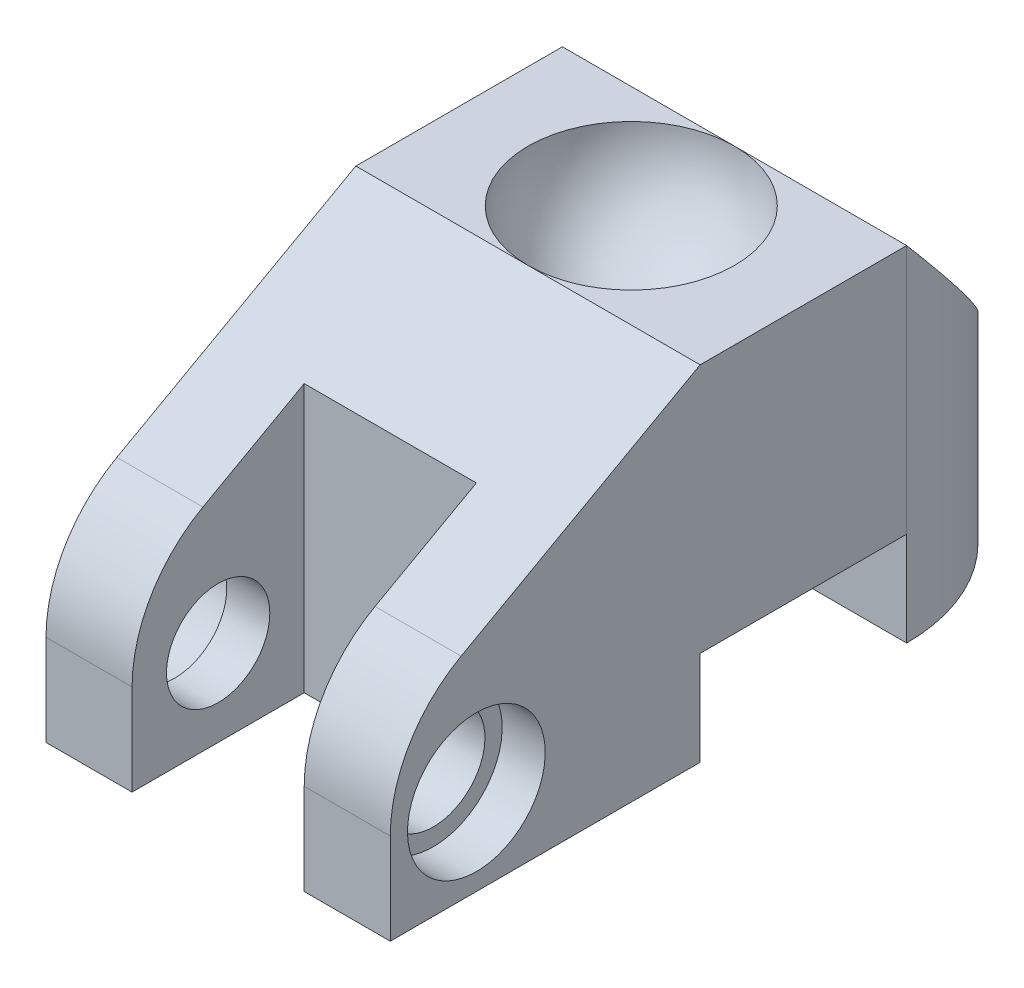
ISO-10303-21;
HEADER;
FILE_DESCRIPTION(('STEP AP214'),'2;1');
FILE_NAME('part.step','',(''),(''),'','','');
FILE_SCHEMA(('AUTOMOTIVE_DESIGN { 1 0 10303 214 1 1 1 1 }'));
ENDSEC;
DATA;
#1=APPLICATION_CONTEXT('core data for automotive mechanical design processes');
#2=APPLICATION_PROTOCOL_DEFINITION('international standard','automotive_design',2000,#1);
#3=PRODUCT_CONTEXT('',#1,'mechanical');
#4=PRODUCT('Part','Part','',(#3));
#5=PRODUCT_RELATED_PRODUCT_CATEGORY('part','',(#4));
#6=PRODUCT_DEFINITION_FORMATION('','',#4);
#7=PRODUCT_DEFINITION_CONTEXT('part definition',#1,'design');
#8=PRODUCT_DEFINITION('design','',#6,#7);
#9=PRODUCT_DEFINITION_SHAPE('','',#8);
#10=(LENGTH_UNIT() NAMED_UNIT(*) SI_UNIT(.MILLI.,.METRE.));
#11=(NAMED_UNIT(*) PLANE_ANGLE_UNIT() SI_UNIT($,.RADIAN.));
#12=(NAMED_UNIT(*) SI_UNIT($,.STERADIAN.) SOLID_ANGLE_UNIT());
#13=UNCERTAINTY_MEASURE_WITH_UNIT(LENGTH_MEASURE(1.E-05),#10,'distance_accuracy_value','');
#14=(GEOMETRIC_REPRESENTATION_CONTEXT(3) GLOBAL_UNCERTAINTY_ASSIGNED_CONTEXT((#13)) GLOBAL_UNIT_ASSIGNED_CONTEXT((#10,
#11,#12)) REPRESENTATION_CONTEXT('',''));
#15=CARTESIAN_POINT('',(0.,0.,0.));
#16=DIRECTION('',(0.,0.,1.));
#17=DIRECTION('',(1.,0.,0.));
#18=AXIS2_PLACEMENT_3D('',#15,#16,#17);
#19=CARTESIAN_POINT('',(-9.21751760374971,-5.480254557204,0.));
#20=DIRECTION('',(0.,-1.,0.));
#21=DIRECTION('',(1.,0.,0.));
#22=AXIS2_PLACEMENT_3D('',#19,#20,#21);
#23=PLANE('',#22);
#24=DIRECTION('',(1.,0.,0.));
#25=VECTOR('',#24,1.);
#26=CARTESIAN_POINT('',(-9.21751760374971,-5.480254557204,10.));
#27=LINE('',#26,#25);
#28=CARTESIAN_POINT('',(-9.21751760374971,-5.48025455720399,10.));
#29=VERTEX_POINT('',#28);
#30=CARTESIAN_POINT('',(0.249664375506131,-5.480254557204,10.));
#31=VERTEX_POINT('',#30);
#32=EDGE_CURVE('E230',#29,#31,#27,.T.);
#33=ORIENTED_EDGE('',*,*,#32,.T.);
#34=CARTESIAN_POINT('',(0.782482396250295,-5.480254557204,16.));
#35=DIRECTION('',(0.,-1.,0.));
#36=DIRECTION('',(1.,0.,0.));
#37=AXIS2_PLACEMENT_3D('',#34,#35,#36);
#38=CIRCLE('',#37,6.02361146184166);
#39=CARTESIAN_POINT('',(0.249664375505311,-5.480254557204,22.));
#40=VERTEX_POINT('',#39);
#41=EDGE_CURVE('E195',#40,#31,#38,.T.);
#42=ORIENTED_EDGE('',*,*,#41,.F.);
#43=DIRECTION('',(1.,0.,0.));
#44=VECTOR('',#43,1.);
#45=CARTESIAN_POINT('',(-9.21751760374971,-5.480254557204,22.));
#46=LINE('',#45,#44);
#47=CARTESIAN_POINT('',(-9.21751760374971,-5.480254557204,22.));
#48=VERTEX_POINT('',#47);
#49=EDGE_CURVE('E208',#48,#40,#46,.T.);
#50=ORIENTED_EDGE('',*,*,#49,.F.);
#51=DIRECTION('',(0.,0.,-1.));
#52=VECTOR('',#51,1.);
#53=CARTESIAN_POINT('',(-9.21751760374971,-5.480254557204,0.));
#54=LINE('',#53,#52);
#55=EDGE_CURVE('E312',#48,#29,#54,.T.);
#56=ORIENTED_EDGE('',*,*,#55,.T.);
#57=EDGE_LOOP('',(#33,#42,#50,#56));
#58=FACE_BOUND('',#57,.T.);
#59=ADVANCED_FACE('F56',(#58),#23,.T.);
#60=CARTESIAN_POINT('',(-9.21751760374971,0.,10.));
#61=DIRECTION('',(0.,0.,1.));
#62=DIRECTION('',(1.,0.,0.));
#63=AXIS2_PLACEMENT_3D('',#60,#61,#62);
#64=PLANE('',#63);
#65=CARTESIAN_POINT('',(1.31530041699446,-5.480254557204,10.));
#66=VERTEX_POINT('',#65);
#67=CARTESIAN_POINT('',(10.7824823962503,-5.48025455720399,10.));
#68=VERTEX_POINT('',#67);
#69=EDGE_CURVE('E329',#66,#68,#27,.T.);
#70=ORIENTED_EDGE('',*,*,#69,.F.);
#71=DIRECTION('',(0.,1.,0.));
#72=VECTOR('',#71,1.);
#73=CARTESIAN_POINT('',(1.31530041699446,-8.48025455720399,10.));
#74=LINE('',#73,#72);
#75=CARTESIAN_POINT('',(1.31530041699446,-8.48025455720399,10.));
#76=VERTEX_POINT('',#75);
#77=EDGE_CURVE('E191',#66,#76,#74,.F.);
#78=ORIENTED_EDGE('',*,*,#77,.T.);
#79=DIRECTION('',(1.,0.,0.));
#80=VECTOR('',#79,1.);
#81=CARTESIAN_POINT('',(-9.21751760374971,-8.480254557204,10.));
#82=LINE('',#81,#80);
#83=CARTESIAN_POINT('',(0.249664375506132,-8.48025455720399,10.));
#84=VERTEX_POINT('',#83);
#85=EDGE_CURVE('E415',#84,#76,#82,.T.);
#86=ORIENTED_EDGE('',*,*,#85,.F.);
#87=DIRECTION('',(0.,1.,0.));
#88=VECTOR('',#87,1.);
#89=CARTESIAN_POINT('',(0.249664375506132,-8.48025455720399,10.));
#90=LINE('',#89,#88);
#91=EDGE_CURVE('E413',#84,#31,#90,.T.);
#92=ORIENTED_EDGE('',*,*,#91,.T.);
#93=ORIENTED_EDGE('',*,*,#32,.F.);
#94=DIRECTION('',(0.,-1.,0.));
#95=VECTOR('',#94,1.);
#96=CARTESIAN_POINT('',(-9.21751760374971,0.,10.));
#97=LINE('',#96,#95);
#98=CARTESIAN_POINT('',(-9.21751760374971,-10.960509114408,10.));
#99=VERTEX_POINT('',#98);
#100=EDGE_CURVE('E209',#29,#99,#97,.T.);
#101=ORIENTED_EDGE('',*,*,#100,.T.);
#102=DIRECTION('',(1.,0.,0.));
#103=VECTOR('',#102,1.);
#104=CARTESIAN_POINT('',(-9.21751760374971,-10.960509114408,10.));
#105=LINE('',#104,#103);
#106=CARTESIAN_POINT('',(10.7824823962503,-10.960509114408,10.));
#107=VERTEX_POINT('',#106);
#108=EDGE_CURVE('E330',#99,#107,#105,.T.);
#109=ORIENTED_EDGE('',*,*,#108,.T.);
#110=DIRECTION('',(0.,-1.,0.));
#111=VECTOR('',#110,1.);
#112=CARTESIAN_POINT('',(10.7824823962503,0.,10.));
#113=LINE('',#112,#111);
#114=EDGE_CURVE('E318',#68,#107,#113,.T.);
#115=ORIENTED_EDGE('',*,*,#114,.F.);
#116=EDGE_LOOP('',(#70,#78,#86,#92,#93,#101,#109,#115));
#117=FACE_BOUND('',#116,.T.);
#118=ADVANCED_FACE('F436',(#117),#64,.T.);
#119=CARTESIAN_POINT('',(-9.21751760374971,0.,22.));
#120=DIRECTION('',(0.,0.,1.));
#121=DIRECTION('',(1.,0.,0.));
#122=AXIS2_PLACEMENT_3D('',#119,#120,#121);
#123=PLANE('',#122);
#124=DIRECTION('',(0.,1.,0.));
#125=VECTOR('',#124,1.);
#126=CARTESIAN_POINT('',(1.31530041699528,-8.48025455720399,22.));
#127=LINE('',#126,#125);
#128=CARTESIAN_POINT('',(1.31530041699528,-5.480254557204,22.));
#129=VERTEX_POINT('',#128);
#130=CARTESIAN_POINT('',(1.31530041699528,-8.48025455720399,22.));
#131=VERTEX_POINT('',#130);
#132=EDGE_CURVE('E12',#129,#131,#127,.F.);
#133=ORIENTED_EDGE('',*,*,#132,.F.);
#134=CARTESIAN_POINT('',(10.7824823962503,-5.48025455720399,22.));
#135=VERTEX_POINT('',#134);
#136=EDGE_CURVE('E200',#129,#135,#46,.T.);
#137=ORIENTED_EDGE('',*,*,#136,.T.);
#138=DIRECTION('',(0.,-1.,0.));
#139=VECTOR('',#138,1.);
#140=CARTESIAN_POINT('',(10.7824823962503,0.,22.));
#141=LINE('',#140,#139);
#142=CARTESIAN_POINT('',(10.7824823962503,-10.960509114408,22.));
#143=VERTEX_POINT('',#142);
#144=EDGE_CURVE('E321',#135,#143,#141,.T.);
#145=ORIENTED_EDGE('',*,*,#144,.T.);
#146=DIRECTION('',(1.,0.,0.));
#147=VECTOR('',#146,1.);
#148=CARTESIAN_POINT('',(-9.21751760374971,-10.960509114408,22.));
#149=LINE('',#148,#147);
#150=CARTESIAN_POINT('',(-9.21751760374971,-10.960509114408,22.));
#151=VERTEX_POINT('',#150);
#152=EDGE_CURVE('E212',#151,#143,#149,.T.);
#153=ORIENTED_EDGE('',*,*,#152,.F.);
#154=DIRECTION('',(0.,-1.,0.));
#155=VECTOR('',#154,1.);
#156=CARTESIAN_POINT('',(-9.21751760374971,0.,22.));
#157=LINE('',#156,#155);
#158=EDGE_CURVE('E214',#48,#151,#157,.T.);
#159=ORIENTED_EDGE('',*,*,#158,.F.);
#160=ORIENTED_EDGE('',*,*,#49,.T.);
#161=DIRECTION('',(0.,1.,0.));
#162=VECTOR('',#161,1.);
#163=CARTESIAN_POINT('',(0.249664375505312,-8.48025455720399,22.));
#164=LINE('',#163,#162);
#165=CARTESIAN_POINT('',(0.249664375505312,-8.48025455720399,22.));
#166=VERTEX_POINT('',#165);
#167=EDGE_CURVE('E64',#166,#40,#164,.T.);
#168=ORIENTED_EDGE('',*,*,#167,.F.);
#169=DIRECTION('',(1.,0.,0.));
#170=VECTOR('',#169,1.);
#171=CARTESIAN_POINT('',(-9.21751760374971,-8.480254557204,22.));
#172=LINE('',#171,#170);
#173=EDGE_CURVE('E203',#166,#131,#172,.T.);
#174=ORIENTED_EDGE('',*,*,#173,.T.);
#175=EDGE_LOOP('',(#133,#137,#145,#153,#159,#160,#168,#174));
#176=FACE_BOUND('',#175,.T.);
#177=ADVANCED_FACE('F199',(#176),#123,.F.);
#178=CARTESIAN_POINT('',(-9.21751760374971,-5.96050911440799,35.));
#179=DIRECTION('',(1.,0.,0.));
#180=DIRECTION('',(0.,1.,0.));
#181=AXIS2_PLACEMENT_3D('',#178,#179,#180);
#182=CYLINDRICAL_SURFACE('',#181,3.);
#183=CARTESIAN_POINT('',(-4.2175176037497,-5.96050911440799,35.));
#184=DIRECTION('',(1.,0.,0.));
#185=DIRECTION('',(0.,0.,-1.));
#186=AXIS2_PLACEMENT_3D('',#183,#184,#185);
#187=CIRCLE('',#186,3.);
#188=CARTESIAN_POINT('',(-4.2175176037497,-5.96050911440799,32.));
#189=VERTEX_POINT('',#188);
#190=EDGE_CURVE('E268',#189,#189,#187,.T.);
#191=ORIENTED_EDGE('',*,*,#190,.T.);
#192=EDGE_LOOP('',(#191));
#193=FACE_BOUND('',#192,.T.);
#194=CARTESIAN_POINT('',(-6.71751760374971,-5.96050911440799,35.));
#195=DIRECTION('',(-1.,0.,0.));
#196=DIRECTION('',(0.,0.,1.));
#197=AXIS2_PLACEMENT_3D('',#194,#195,#196);
#198=CIRCLE('',#197,3.);
#199=CARTESIAN_POINT('',(-6.71751760374971,-5.96050911440799,38.));
#200=VERTEX_POINT('',#199);
#201=EDGE_CURVE('E273',#200,#200,#198,.F.);
#202=ORIENTED_EDGE('',*,*,#201,.F.);
#203=EDGE_LOOP('',(#202));
#204=FACE_BOUND('',#203,.T.);
#205=ADVANCED_FACE('F502',(#193,#204),#182,.F.);
#206=CARTESIAN_POINT('',(5.7824823962503,-5.96050911440799,35.));
#207=DIRECTION('',(-1.,0.,0.));
#208=DIRECTION('',(0.,0.,1.));
#209=AXIS2_PLACEMENT_3D('',#206,#207,#208);
#210=CIRCLE('',#209,3.);
#211=CARTESIAN_POINT('',(5.7824823962503,-5.96050911440799,38.));
#212=VERTEX_POINT('',#211);
#213=EDGE_CURVE('E265',#212,#212,#210,.T.);
#214=ORIENTED_EDGE('',*,*,#213,.T.);
#215=EDGE_LOOP('',(#214));
#216=FACE_BOUND('',#215,.T.);
#217=CARTESIAN_POINT('',(8.2824823962503,-5.96050911440799,35.));
#218=DIRECTION('',(1.,0.,0.));
#219=DIRECTION('',(0.,1.,0.));
#220=AXIS2_PLACEMENT_3D('',#217,#218,#219);
#221=CIRCLE('',#220,3.);
#222=CARTESIAN_POINT('',(8.2824823962503,-2.96050911440799,35.));
#223=VERTEX_POINT('',#222);
#224=EDGE_CURVE('E269',#223,#223,#221,.F.);
#225=ORIENTED_EDGE('',*,*,#224,.F.);
#226=EDGE_LOOP('',(#225));
#227=FACE_BOUND('',#226,.T.);
#228=ADVANCED_FACE('F447',(#216,#227),#182,.F.);
#229=CARTESIAN_POINT('',(-9.21751760374971,9.03949088559201,40.));
#230=DIRECTION('',(0.,1.,0.));
#231=DIRECTION('',(0.,0.,1.));
#232=AXIS2_PLACEMENT_3D('',#229,#230,#231);
#233=PLANE('',#232);
#234=CARTESIAN_POINT('',(0.782482396250294,9.03949088559201,16.));
#235=DIRECTION('',(0.,1.,0.));
#236=DIRECTION('',(0.,0.,1.));
#237=AXIS2_PLACEMENT_3D('',#234,#235,#236);
#238=CIRCLE('',#237,6.);
#239=CARTESIAN_POINT('',(0.782482396250294,9.03949088559201,22.));
#240=VERTEX_POINT('',#239);
#241=CARTESIAN_POINT('',(0.782482396250294,9.03949088559201,10.));
#242=VERTEX_POINT('',#241);
#243=EDGE_CURVE('E264',#240,#242,#238,.T.);
#244=ORIENTED_EDGE('',*,*,#243,.F.);
#245=DIRECTION('',(1.,0.,0.));
#246=VECTOR('',#245,1.);
#247=CARTESIAN_POINT('',(-9.21751760374971,9.03949088559201,22.));
#248=LINE('',#247,#246);
#249=CARTESIAN_POINT('',(10.7824823962503,9.03949088559201,22.));
#250=VERTEX_POINT('',#249);
#251=EDGE_CURVE('E226',#240,#250,#248,.T.);
#252=ORIENTED_EDGE('',*,*,#251,.T.);
#253=DIRECTION('',(0.,0.,-1.));
#254=VECTOR('',#253,1.);
#255=CARTESIAN_POINT('',(10.7824823962503,9.03949088559201,40.));
#256=LINE('',#255,#254);
#257=CARTESIAN_POINT('',(10.7824823962503,9.03949088559201,10.));
#258=VERTEX_POINT('',#257);
#259=EDGE_CURVE('E248',#250,#258,#256,.T.);
#260=ORIENTED_EDGE('',*,*,#259,.T.);
#261=DIRECTION('',(1.,0.,0.));
#262=VECTOR('',#261,1.);
#263=CARTESIAN_POINT('',(-9.21751760374971,9.03949088559201,10.));
#264=LINE('',#263,#262);
#265=EDGE_CURVE('E222',#242,#258,#264,.T.);
#266=ORIENTED_EDGE('',*,*,#265,.F.);
#267=EDGE_LOOP('',(#244,#252,#260,#266));
#268=FACE_BOUND('',#267,.T.);
#269=ADVANCED_FACE('F381',(#268),#233,.T.);
#270=CARTESIAN_POINT('',(-9.21751760374971,-10.960509114408,40.));
#271=DIRECTION('',(0.,1.,0.));
#272=DIRECTION('',(0.,0.,1.));
#273=AXIS2_PLACEMENT_3D('',#270,#271,#272);
#274=PLANE('',#273);
#275=CARTESIAN_POINT('',(0.782482396250296,-10.960509114408,10.));
#276=DIRECTION('',(0.,-1.,0.));
#277=DIRECTION('',(0.,0.,-1.));
#278=AXIS2_PLACEMENT_3D('',#275,#276,#277);
#279=CIRCLE('',#278,10.);
#280=EDGE_CURVE('E366',#99,#107,#279,.T.);
#281=ORIENTED_EDGE('',*,*,#280,.T.);
#282=ORIENTED_EDGE('',*,*,#108,.F.);
#283=EDGE_LOOP('',(#281,#282));
#284=FACE_BOUND('',#283,.T.);
#285=ADVANCED_FACE('F438',(#284),#274,.F.);
#286=CARTESIAN_POINT('',(-9.21751760374971,-1.14765208474084,1.35189033435883));
#287=DIRECTION('',(0.,0.647172056126059,-0.76234397077013));
#288=DIRECTION('',(0.,0.76234397077013,0.647172056126059));
#289=AXIS2_PLACEMENT_3D('',#286,#287,#288);
#290=PLANE('',#289);
#291=CARTESIAN_POINT('',(-9.21751760374971,9.03949088559201,10.));
#292=VERTEX_POINT('',#291);
#293=EDGE_CURVE('E219',#292,#242,#264,.T.);
#294=ORIENTED_EDGE('',*,*,#293,.T.);
#295=ORIENTED_EDGE('',*,*,#265,.T.);
#296=CARTESIAN_POINT('',(0.782482396250296,9.03949088559201,10.));
#297=DIRECTION('',(0.,0.647172056126059,-0.76234397077013));
#298=DIRECTION('',(0.,-0.76234397077013,-0.647172056126059));
#299=AXIS2_PLACEMENT_3D('',#296,#297,#298);
#300=ELLIPSE('',#299,15.4518414467082,10.);
#301=EDGE_CURVE('E324',#258,#292,#300,.T.);
#302=ORIENTED_EDGE('',*,*,#301,.T.);
#303=EDGE_LOOP('',(#294,#295,#302));
#304=FACE_BOUND('',#303,.T.);
#305=ADVANCED_FACE('F372',(#304),#290,.T.);
#306=CARTESIAN_POINT('',(0.,0.,40.));
#307=DIRECTION('',(0.,0.,-1.));
#308=DIRECTION('',(-1.,0.,0.));
#309=AXIS2_PLACEMENT_3D('',#306,#307,#308);
#310=PLANE('',#309);
#311=DIRECTION('',(0.,-1.,0.));
#312=VECTOR('',#311,1.);
#313=CARTESIAN_POINT('',(-4.21751760374971,9.03949088559201,40.));
#314=LINE('',#313,#312);
#315=CARTESIAN_POINT('',(-4.21751760374971,-5.66773590639643,40.));
#316=VERTEX_POINT('',#315);
#317=CARTESIAN_POINT('',(-4.21751760374971,-10.960509114408,40.));
#318=VERTEX_POINT('',#317);
#319=EDGE_CURVE('E361',#316,#318,#314,.T.);
#320=ORIENTED_EDGE('',*,*,#319,.F.);
#321=DIRECTION('',(1.,0.,0.));
#322=VECTOR('',#321,1.);
#323=CARTESIAN_POINT('',(-9.21751760374971,-5.66773590639643,40.));
#324=LINE('',#323,#322);
#325=CARTESIAN_POINT('',(-9.21751760374971,-5.66773590639643,40.));
#326=VERTEX_POINT('',#325);
#327=EDGE_CURVE('E286',#316,#326,#324,.F.);
#328=ORIENTED_EDGE('',*,*,#327,.T.);
#329=DIRECTION('',(0.,-1.,0.));
#330=VECTOR('',#329,1.);
#331=CARTESIAN_POINT('',(-9.21751760374971,9.03949088559201,40.));
#332=LINE('',#331,#330);
#333=CARTESIAN_POINT('',(-9.21751760374971,-10.960509114408,40.));
#334=VERTEX_POINT('',#333);
#335=EDGE_CURVE('E240',#326,#334,#332,.T.);
#336=ORIENTED_EDGE('',*,*,#335,.T.);
#337=DIRECTION('',(1.,0.,0.));
#338=VECTOR('',#337,1.);
#339=CARTESIAN_POINT('',(-9.21751760374971,-10.960509114408,40.));
#340=LINE('',#339,#338);
#341=EDGE_CURVE('E235',#334,#318,#340,.T.);
#342=ORIENTED_EDGE('',*,*,#341,.T.);
#343=EDGE_LOOP('',(#320,#328,#336,#342));
#344=FACE_BOUND('',#343,.T.);
#345=ADVANCED_FACE('F445',(#344),#310,.F.);
#346=DIRECTION('',(0.,-1.,0.));
#347=VECTOR('',#346,1.);
#348=CARTESIAN_POINT('',(10.7824823962503,9.03949088559201,40.));
#349=LINE('',#348,#347);
#350=CARTESIAN_POINT('',(10.7824823962503,-5.66773590639643,40.));
#351=VERTEX_POINT('',#350);
#352=CARTESIAN_POINT('',(10.7824823962503,-10.960509114408,40.));
#353=VERTEX_POINT('',#352);
#354=EDGE_CURVE('E238',#351,#353,#349,.T.);
#355=ORIENTED_EDGE('',*,*,#354,.F.);
#356=DIRECTION('',(1.,0.,0.));
#357=VECTOR('',#356,1.);
#358=CARTESIAN_POINT('',(5.78248239625029,-5.66773590639643,40.));
#359=LINE('',#358,#357);
#360=CARTESIAN_POINT('',(5.78248239625029,-5.66773590639643,40.));
#361=VERTEX_POINT('',#360);
#362=EDGE_CURVE('E78',#351,#361,#359,.F.);
#363=ORIENTED_EDGE('',*,*,#362,.T.);
#364=DIRECTION('',(0.,-1.,0.));
#365=VECTOR('',#364,1.);
#366=CARTESIAN_POINT('',(5.78248239625029,9.03949088559201,40.));
#367=LINE('',#366,#365);
#368=CARTESIAN_POINT('',(5.78248239625029,-10.960509114408,40.));
#369=VERTEX_POINT('',#368);
#370=EDGE_CURVE('E345',#361,#369,#367,.T.);
#371=ORIENTED_EDGE('',*,*,#370,.T.);
#372=EDGE_CURVE('E234',#369,#353,#340,.T.);
#373=ORIENTED_EDGE('',*,*,#372,.T.);
#374=EDGE_LOOP('',(#355,#363,#371,#373));
#375=FACE_BOUND('',#374,.T.);
#376=ADVANCED_FACE('F344',(#375),#310,.F.);
#377=DIRECTION('',(0.,0.,1.));
#378=VECTOR('',#377,1.);
#379=CARTESIAN_POINT('',(-4.2175176037497,-10.960509114408,0.));
#380=LINE('',#379,#378);
#381=CARTESIAN_POINT('',(-4.2175176037497,-10.960509114408,30.));
#382=VERTEX_POINT('',#381);
#383=EDGE_CURVE('E357',#382,#318,#380,.T.);
#384=ORIENTED_EDGE('',*,*,#383,.T.);
#385=ORIENTED_EDGE('',*,*,#341,.F.);
#386=DIRECTION('',(0.,0.,-1.));
#387=VECTOR('',#386,1.);
#388=CARTESIAN_POINT('',(-9.21751760374971,-10.960509114408,40.));
#389=LINE('',#388,#387);
#390=EDGE_CURVE('E242',#334,#151,#389,.T.);
#391=ORIENTED_EDGE('',*,*,#390,.T.);
#392=ORIENTED_EDGE('',*,*,#152,.T.);
#393=DIRECTION('',(0.,0.,-1.));
#394=VECTOR('',#393,1.);
#395=CARTESIAN_POINT('',(10.7824823962503,-10.960509114408,40.));
#396=LINE('',#395,#394);
#397=EDGE_CURVE('E251',#353,#143,#396,.T.);
#398=ORIENTED_EDGE('',*,*,#397,.F.);
#399=ORIENTED_EDGE('',*,*,#372,.F.);
#400=DIRECTION('',(0.,0.,-1.));
#401=VECTOR('',#400,1.);
#402=CARTESIAN_POINT('',(5.78248239625031,-10.960509114408,0.));
#403=LINE('',#402,#401);
#404=CARTESIAN_POINT('',(5.7824823962503,-10.960509114408,30.));
#405=VERTEX_POINT('',#404);
#406=EDGE_CURVE('E349',#369,#405,#403,.T.);
#407=ORIENTED_EDGE('',*,*,#406,.T.);
#408=DIRECTION('',(1.,0.,0.));
#409=VECTOR('',#408,1.);
#410=CARTESIAN_POINT('',(0.,-10.960509114408,30.));
#411=LINE('',#410,#409);
#412=EDGE_CURVE('E351',#382,#405,#411,.T.);
#413=ORIENTED_EDGE('',*,*,#412,.F.);
#414=EDGE_LOOP('',(#384,#385,#391,#392,#398,#399,#407,#413));
#415=FACE_BOUND('',#414,.T.);
#416=ADVANCED_FACE('F338',(#415),#274,.F.);
#417=CARTESIAN_POINT('',(-9.21751760374971,16.2471581295562,9.02619896086453));
#418=DIRECTION('',(0.,0.874157276121538,0.485642931178632));
#419=DIRECTION('',(0.,-0.485642931178632,0.874157276121538));
#420=AXIS2_PLACEMENT_3D('',#417,#418,#419);
#421=PLANE('',#420);
#422=DIRECTION('',(0.,-0.485642931178632,0.874157276121538));
#423=VECTOR('',#422,1.);
#424=CARTESIAN_POINT('',(-9.21751760374971,16.2471581295562,9.02619896086453));
#425=LINE('',#424,#423);
#426=CARTESIAN_POINT('',(-9.21751760374971,9.03949088559201,22.));
#427=VERTEX_POINT('',#426);
#428=CARTESIAN_POINT('',(-9.21751760374971,1.32552230257586,35.8851434494291));
#429=VERTEX_POINT('',#428);
#430=EDGE_CURVE('E223',#427,#429,#425,.T.);
#431=ORIENTED_EDGE('',*,*,#430,.T.);
#432=DIRECTION('',(1.,0.,0.));
#433=VECTOR('',#432,1.);
#434=CARTESIAN_POINT('',(-4.21751760374971,1.32552230257587,35.8851434494291));
#435=LINE('',#434,#433);
#436=CARTESIAN_POINT('',(-4.2175176037497,1.32552230257587,35.8851434494291));
#437=VERTEX_POINT('',#436);
#438=EDGE_CURVE('E281',#429,#437,#435,.T.);
#439=ORIENTED_EDGE('',*,*,#438,.T.);
#440=DIRECTION('',(0.,0.485642931178632,-0.874157276121538));
#441=VECTOR('',#440,1.);
#442=CARTESIAN_POINT('',(-4.2175176037497,16.2471581295562,9.02619896086454));
#443=LINE('',#442,#441);
#444=CARTESIAN_POINT('',(-4.2175176037497,4.59504644114757,30.));
#445=VERTEX_POINT('',#444);
#446=EDGE_CURVE('E260',#437,#445,#443,.T.);
#447=ORIENTED_EDGE('',*,*,#446,.T.);
#448=DIRECTION('',(-1.,0.,0.));
#449=VECTOR('',#448,1.);
#450=CARTESIAN_POINT('',(-9.21751760374971,4.59504644114757,30.));
#451=LINE('',#450,#449);
#452=CARTESIAN_POINT('',(5.7824823962503,4.59504644114757,30.));
#453=VERTEX_POINT('',#452);
#454=EDGE_CURVE('E254',#453,#445,#451,.T.);
#455=ORIENTED_EDGE('',*,*,#454,.F.);
#456=DIRECTION('',(0.,-0.485642931178632,0.874157276121538));
#457=VECTOR('',#456,1.);
#458=CARTESIAN_POINT('',(5.7824823962503,16.2471581295562,9.02619896086454));
#459=LINE('',#458,#457);
#460=CARTESIAN_POINT('',(5.78248239625029,1.32552230257587,35.8851434494291));
#461=VERTEX_POINT('',#460);
#462=EDGE_CURVE('E257',#453,#461,#459,.T.);
#463=ORIENTED_EDGE('',*,*,#462,.T.);
#464=DIRECTION('',(1.,0.,0.));
#465=VECTOR('',#464,1.);
#466=CARTESIAN_POINT('',(10.7824823962503,1.32552230257588,35.8851434494291));
#467=LINE('',#466,#465);
#468=CARTESIAN_POINT('',(10.7824823962503,1.32552230257587,35.8851434494291));
#469=VERTEX_POINT('',#468);
#470=EDGE_CURVE('E278',#461,#469,#467,.T.);
#471=ORIENTED_EDGE('',*,*,#470,.T.);
#472=DIRECTION('',(0.,-0.485642931178632,0.874157276121538));
#473=VECTOR('',#472,1.);
#474=CARTESIAN_POINT('',(10.7824823962503,16.2471581295562,9.02619896086453));
#475=LINE('',#474,#473);
#476=EDGE_CURVE('E227',#250,#469,#475,.T.);
#477=ORIENTED_EDGE('',*,*,#476,.F.);
#478=ORIENTED_EDGE('',*,*,#251,.F.);
#479=EDGE_CURVE('E231',#427,#240,#248,.T.);
#480=ORIENTED_EDGE('',*,*,#479,.F.);
#481=EDGE_LOOP('',(#431,#439,#447,#455,#463,#471,#477,#478,#480));
#482=FACE_BOUND('',#481,.T.);
#483=ADVANCED_FACE('F385',(#482),#421,.T.);
#484=CARTESIAN_POINT('',(10.7824823962503,9.03949088559201,40.));
#485=DIRECTION('',(1.,0.,0.));
#486=DIRECTION('',(0.,1.,0.));
#487=AXIS2_PLACEMENT_3D('',#484,#485,#486);
#488=PLANE('',#487);
#489=CARTESIAN_POINT('',(10.7824823962503,-5.96050911440799,35.));
#490=DIRECTION('',(1.,0.,0.));
#491=DIRECTION('',(0.,1.,0.));
#492=AXIS2_PLACEMENT_3D('',#489,#490,#491);
#493=CIRCLE('',#492,4.);
#494=CARTESIAN_POINT('',(10.7824823962503,-1.96050911440799,35.));
#495=VERTEX_POINT('',#494);
#496=EDGE_CURVE('E276',#495,#495,#493,.T.);
#497=ORIENTED_EDGE('',*,*,#496,.F.);
#498=EDGE_LOOP('',(#497));
#499=FACE_BOUND('',#498,.T.);
#500=ORIENTED_EDGE('',*,*,#476,.T.);
#501=CARTESIAN_POINT('',(10.7824823962503,-5.66773590639643,32.));
#502=DIRECTION('',(1.,0.,0.));
#503=DIRECTION('',(0.,1.,0.));
#504=AXIS2_PLACEMENT_3D('',#501,#502,#503);
#505=CIRCLE('',#504,8.);
#506=EDGE_CURVE('E290',#469,#351,#505,.T.);
#507=ORIENTED_EDGE('',*,*,#506,.T.);
#508=ORIENTED_EDGE('',*,*,#354,.T.);
#509=ORIENTED_EDGE('',*,*,#397,.T.);
#510=ORIENTED_EDGE('',*,*,#144,.F.);
#511=DIRECTION('',(0.,0.,-1.));
#512=VECTOR('',#511,1.);
#513=CARTESIAN_POINT('',(10.7824823962503,-5.48025455720399,0.));
#514=LINE('',#513,#512);
#515=EDGE_CURVE('E206',#135,#68,#514,.T.);
#516=ORIENTED_EDGE('',*,*,#515,.T.);
#517=DIRECTION('',(0.,-1.,0.));
#518=VECTOR('',#517,1.);
#519=CARTESIAN_POINT('',(10.7824823962503,9.03949088559201,10.));
#520=LINE('',#519,#518);
#521=EDGE_CURVE('E363',#258,#68,#520,.T.);
#522=ORIENTED_EDGE('',*,*,#521,.F.);
#523=ORIENTED_EDGE('',*,*,#259,.F.);
#524=EDGE_LOOP('',(#500,#507,#508,#509,#510,#516,#522,#523));
#525=FACE_BOUND('',#524,.T.);
#526=ADVANCED_FACE('F342',(#499,#525),#488,.T.);
#527=EDGE_CURVE('E262',#242,#240,#238,.T.);
#528=ORIENTED_EDGE('',*,*,#527,.F.);
#529=ORIENTED_EDGE('',*,*,#293,.F.);
#530=DIRECTION('',(0.,0.,-1.));
#531=VECTOR('',#530,1.);
#532=CARTESIAN_POINT('',(-9.21751760374971,9.03949088559201,40.));
#533=LINE('',#532,#531);
#534=EDGE_CURVE('E245',#427,#292,#533,.T.);
#535=ORIENTED_EDGE('',*,*,#534,.F.);
#536=ORIENTED_EDGE('',*,*,#479,.T.);
#537=EDGE_LOOP('',(#528,#529,#535,#536));
#538=FACE_BOUND('',#537,.T.);
#539=ADVANCED_FACE('F449',(#538),#233,.T.);
#540=CARTESIAN_POINT('',(-9.21751760374971,9.03949088559201,40.));
#541=DIRECTION('',(1.,0.,0.));
#542=DIRECTION('',(0.,0.,-1.));
#543=AXIS2_PLACEMENT_3D('',#540,#541,#542);
#544=PLANE('',#543);
#545=CARTESIAN_POINT('',(-9.21751760374971,-5.96050911440799,35.));
#546=DIRECTION('',(-1.,0.,0.));
#547=DIRECTION('',(0.,0.,1.));
#548=AXIS2_PLACEMENT_3D('',#545,#546,#547);
#549=CIRCLE('',#548,4.00000000000001);
#550=CARTESIAN_POINT('',(-9.21751760374971,-5.96050911440799,39.));
#551=VERTEX_POINT('',#550);
#552=EDGE_CURVE('E407',#551,#551,#549,.T.);
#553=ORIENTED_EDGE('',*,*,#552,.F.);
#554=EDGE_LOOP('',(#553));
#555=FACE_BOUND('',#554,.T.);
#556=ORIENTED_EDGE('',*,*,#335,.F.);
#557=CARTESIAN_POINT('',(-9.21751760374971,-5.66773590639643,32.));
#558=DIRECTION('',(1.,0.,0.));
#559=DIRECTION('',(0.,0.,-1.));
#560=AXIS2_PLACEMENT_3D('',#557,#558,#559);
#561=CIRCLE('',#560,8.);
#562=EDGE_CURVE('E288',#326,#429,#561,.F.);
#563=ORIENTED_EDGE('',*,*,#562,.T.);
#564=ORIENTED_EDGE('',*,*,#430,.F.);
#565=ORIENTED_EDGE('',*,*,#534,.T.);
#566=DIRECTION('',(0.,-1.,0.));
#567=VECTOR('',#566,1.);
#568=CARTESIAN_POINT('',(-9.21751760374971,9.03949088559201,10.));
#569=LINE('',#568,#567);
#570=EDGE_CURVE('E317',#292,#29,#569,.T.);
#571=ORIENTED_EDGE('',*,*,#570,.T.);
#572=ORIENTED_EDGE('',*,*,#55,.F.);
#573=ORIENTED_EDGE('',*,*,#158,.T.);
#574=ORIENTED_EDGE('',*,*,#390,.F.);
#575=EDGE_LOOP('',(#556,#563,#564,#565,#571,#572,#573,#574));
#576=FACE_BOUND('',#575,.T.);
#577=ADVANCED_FACE('F316',(#555,#576),#544,.F.);
#578=ORIENTED_EDGE('',*,*,#136,.F.);
#579=EDGE_CURVE('E186',#66,#129,#38,.T.);
#580=ORIENTED_EDGE('',*,*,#579,.F.);
#581=ORIENTED_EDGE('',*,*,#69,.T.);
#582=ORIENTED_EDGE('',*,*,#515,.F.);
#583=EDGE_LOOP('',(#578,#580,#581,#582));
#584=FACE_BOUND('',#583,.T.);
#585=ADVANCED_FACE('F204',(#584),#23,.T.);
#586=CARTESIAN_POINT('',(0.782482396250296,9.03949088559201,10.));
#587=DIRECTION('',(0.,-1.,0.));
#588=DIRECTION('',(0.,0.,-1.));
#589=AXIS2_PLACEMENT_3D('',#586,#587,#588);
#590=CYLINDRICAL_SURFACE('',#589,10.);
#591=ORIENTED_EDGE('',*,*,#301,.F.);
#592=ORIENTED_EDGE('',*,*,#521,.T.);
#593=ORIENTED_EDGE('',*,*,#114,.T.);
#594=ORIENTED_EDGE('',*,*,#280,.F.);
#595=ORIENTED_EDGE('',*,*,#100,.F.);
#596=ORIENTED_EDGE('',*,*,#570,.F.);
#597=EDGE_LOOP('',(#591,#592,#593,#594,#595,#596));
#598=FACE_BOUND('',#597,.T.);
#599=ADVANCED_FACE('F378',(#598),#590,.T.);
#600=CARTESIAN_POINT('',(-4.2175176037497,9.03949088559201,0.));
#601=DIRECTION('',(1.,0.,0.));
#602=DIRECTION('',(0.,0.,-1.));
#603=AXIS2_PLACEMENT_3D('',#600,#601,#602);
#604=PLANE('',#603);
#605=ORIENTED_EDGE('',*,*,#190,.F.);
#606=EDGE_LOOP('',(#605));
#607=FACE_BOUND('',#606,.T.);
#608=ORIENTED_EDGE('',*,*,#446,.F.);
#609=CARTESIAN_POINT('',(-4.2175176037497,-5.66773590639643,32.));
#610=DIRECTION('',(1.,0.,0.));
#611=DIRECTION('',(0.,0.,-1.));
#612=AXIS2_PLACEMENT_3D('',#609,#610,#611);
#613=CIRCLE('',#612,8.);
#614=EDGE_CURVE('E284',#437,#316,#613,.T.);
#615=ORIENTED_EDGE('',*,*,#614,.T.);
#616=ORIENTED_EDGE('',*,*,#319,.T.);
#617=ORIENTED_EDGE('',*,*,#383,.F.);
#618=DIRECTION('',(0.,-1.,0.));
#619=VECTOR('',#618,1.);
#620=CARTESIAN_POINT('',(-4.2175176037497,9.03949088559201,30.));
#621=LINE('',#620,#619);
#622=EDGE_CURVE('E353',#445,#382,#621,.T.);
#623=ORIENTED_EDGE('',*,*,#622,.F.);
#624=EDGE_LOOP('',(#608,#615,#616,#617,#623));
#625=FACE_BOUND('',#624,.T.);
#626=ADVANCED_FACE('F398',(#607,#625),#604,.T.);
#627=CARTESIAN_POINT('',(5.78248239625031,9.03949088559201,0.));
#628=DIRECTION('',(-1.,0.,0.));
#629=DIRECTION('',(0.,0.,1.));
#630=AXIS2_PLACEMENT_3D('',#627,#628,#629);
#631=PLANE('',#630);
#632=ORIENTED_EDGE('',*,*,#213,.F.);
#633=EDGE_LOOP('',(#632));
#634=FACE_BOUND('',#633,.T.);
#635=ORIENTED_EDGE('',*,*,#370,.F.);
#636=CARTESIAN_POINT('',(5.7824823962503,-5.66773590639643,32.));
#637=DIRECTION('',(-1.,0.,0.));
#638=DIRECTION('',(0.,0.,1.));
#639=AXIS2_PLACEMENT_3D('',#636,#637,#638);
#640=CIRCLE('',#639,8.);
#641=EDGE_CURVE('E293',#361,#461,#640,.T.);
#642=ORIENTED_EDGE('',*,*,#641,.T.);
#643=ORIENTED_EDGE('',*,*,#462,.F.);
#644=DIRECTION('',(0.,-1.,0.));
#645=VECTOR('',#644,1.);
#646=CARTESIAN_POINT('',(5.7824823962503,9.03949088559201,30.));
#647=LINE('',#646,#645);
#648=EDGE_CURVE('E355',#453,#405,#647,.T.);
#649=ORIENTED_EDGE('',*,*,#648,.T.);
#650=ORIENTED_EDGE('',*,*,#406,.F.);
#651=EDGE_LOOP('',(#635,#642,#643,#649,#650));
#652=FACE_BOUND('',#651,.T.);
#653=ADVANCED_FACE('F391',(#634,#652),#631,.T.);
#654=CARTESIAN_POINT('',(0.,9.03949088559201,30.));
#655=DIRECTION('',(0.,0.,-1.));
#656=DIRECTION('',(-1.,0.,0.));
#657=AXIS2_PLACEMENT_3D('',#654,#655,#656);
#658=PLANE('',#657);
#659=ORIENTED_EDGE('',*,*,#454,.T.);
#660=ORIENTED_EDGE('',*,*,#622,.T.);
#661=ORIENTED_EDGE('',*,*,#412,.T.);
#662=ORIENTED_EDGE('',*,*,#648,.F.);
#663=EDGE_LOOP('',(#659,#660,#661,#662));
#664=FACE_BOUND('',#663,.T.);
#665=ADVANCED_FACE('F395',(#664),#658,.F.);
#666=CARTESIAN_POINT('',(0.782482396250294,9.03949088559201,16.));
#667=DIRECTION('',(-1.,0.,0.));
#668=DIRECTION('',(0.,0.,-1.));
#669=AXIS2_PLACEMENT_3D('',#666,#667,#668);
#670=SPHERICAL_SURFACE('',#669,6.);
#671=CARTESIAN_POINT('',(0.782482396250294,9.03949088559201,16.));
#672=DIRECTION('',(0.,1.,0.));
#673=DIRECTION('',(0.,0.,1.));
#674=AXIS2_PLACEMENT_3D('',#671,#672,#673);
#675=SPHERICAL_SURFACE('',#674,6.);
#676=ORIENTED_EDGE('',*,*,#243,.T.);
#677=ORIENTED_EDGE('',*,*,#527,.T.);
#678=EDGE_LOOP('',(#676,#677));
#679=FACE_BOUND('',#678,.T.);
#680=ADVANCED_FACE('F494',(#679),#675,.F.);
#681=CARTESIAN_POINT('',(8.28248239625029,-5.96050911440799,35.));
#682=DIRECTION('',(1.,0.,0.));
#683=DIRECTION('',(0.,1.,0.));
#684=AXIS2_PLACEMENT_3D('',#681,#682,#683);
#685=PLANE('',#684);
#686=CARTESIAN_POINT('',(8.28248239625029,-5.96050911440799,35.));
#687=DIRECTION('',(1.,0.,0.));
#688=DIRECTION('',(0.,1.,0.));
#689=AXIS2_PLACEMENT_3D('',#686,#687,#688);
#690=CIRCLE('',#689,4.);
#691=CARTESIAN_POINT('',(8.28248239625029,-1.96050911440799,35.));
#692=VERTEX_POINT('',#691);
#693=EDGE_CURVE('E272',#692,#692,#690,.T.);
#694=ORIENTED_EDGE('',*,*,#693,.T.);
#695=EDGE_LOOP('',(#694));
#696=FACE_BOUND('',#695,.T.);
#697=ORIENTED_EDGE('',*,*,#224,.T.);
#698=EDGE_LOOP('',(#697));
#699=FACE_BOUND('',#698,.T.);
#700=ADVANCED_FACE('F484',(#696,#699),#685,.T.);
#701=CARTESIAN_POINT('',(8.28248239625029,-5.96050911440799,35.));
#702=DIRECTION('',(1.,0.,0.));
#703=DIRECTION('',(0.,1.,0.));
#704=AXIS2_PLACEMENT_3D('',#701,#702,#703);
#705=CYLINDRICAL_SURFACE('',#704,4.);
#706=ORIENTED_EDGE('',*,*,#693,.F.);
#707=EDGE_LOOP('',(#706));
#708=FACE_BOUND('',#707,.T.);
#709=ORIENTED_EDGE('',*,*,#496,.T.);
#710=EDGE_LOOP('',(#709));
#711=FACE_BOUND('',#710,.T.);
#712=ADVANCED_FACE('F481',(#708,#711),#705,.F.);
#713=CARTESIAN_POINT('',(-6.71751760374971,-5.96050911440799,35.));
#714=DIRECTION('',(-1.,0.,0.));
#715=DIRECTION('',(0.,0.,1.));
#716=AXIS2_PLACEMENT_3D('',#713,#714,#715);
#717=PLANE('',#716);
#718=CARTESIAN_POINT('',(-6.71751760374971,-5.96050911440799,35.));
#719=DIRECTION('',(-1.,0.,0.));
#720=DIRECTION('',(0.,0.,1.));
#721=AXIS2_PLACEMENT_3D('',#718,#719,#720);
#722=CIRCLE('',#721,4.00000000000001);
#723=CARTESIAN_POINT('',(-6.71751760374971,-5.96050911440799,39.));
#724=VERTEX_POINT('',#723);
#725=EDGE_CURVE('E277',#724,#724,#722,.T.);
#726=ORIENTED_EDGE('',*,*,#725,.T.);
#727=EDGE_LOOP('',(#726));
#728=FACE_BOUND('',#727,.T.);
#729=ORIENTED_EDGE('',*,*,#201,.T.);
#730=EDGE_LOOP('',(#729));
#731=FACE_BOUND('',#730,.T.);
#732=ADVANCED_FACE('F483',(#728,#731),#717,.T.);
#733=CARTESIAN_POINT('',(-6.71751760374971,-5.96050911440799,35.));
#734=DIRECTION('',(-1.,0.,0.));
#735=DIRECTION('',(0.,0.,1.));
#736=AXIS2_PLACEMENT_3D('',#733,#734,#735);
#737=CYLINDRICAL_SURFACE('',#736,4.00000000000001);
#738=ORIENTED_EDGE('',*,*,#725,.F.);
#739=EDGE_LOOP('',(#738));
#740=FACE_BOUND('',#739,.T.);
#741=ORIENTED_EDGE('',*,*,#552,.T.);
#742=EDGE_LOOP('',(#741));
#743=FACE_BOUND('',#742,.T.);
#744=ADVANCED_FACE('F491',(#740,#743),#737,.F.);
#745=CARTESIAN_POINT('',(-9.21751760374971,-5.66773590639643,32.));
#746=DIRECTION('',(-1.,0.,0.));
#747=DIRECTION('',(0.,-1.,0.));
#748=AXIS2_PLACEMENT_3D('',#745,#746,#747);
#749=CYLINDRICAL_SURFACE('',#748,8.);
#750=ORIENTED_EDGE('',*,*,#562,.F.);
#751=ORIENTED_EDGE('',*,*,#327,.F.);
#752=ORIENTED_EDGE('',*,*,#614,.F.);
#753=ORIENTED_EDGE('',*,*,#438,.F.);
#754=EDGE_LOOP('',(#750,#751,#752,#753));
#755=FACE_BOUND('',#754,.T.);
#756=ADVANCED_FACE('F588',(#755),#749,.T.);
#757=CARTESIAN_POINT('',(-9.21751760374971,-5.66773590639643,32.));
#758=DIRECTION('',(-1.,0.,0.));
#759=DIRECTION('',(0.,-1.,0.));
#760=AXIS2_PLACEMENT_3D('',#757,#758,#759);
#761=CYLINDRICAL_SURFACE('',#760,8.);
#762=ORIENTED_EDGE('',*,*,#641,.F.);
#763=ORIENTED_EDGE('',*,*,#362,.F.);
#764=ORIENTED_EDGE('',*,*,#506,.F.);
#765=ORIENTED_EDGE('',*,*,#470,.F.);
#766=EDGE_LOOP('',(#762,#763,#764,#765));
#767=FACE_BOUND('',#766,.T.);
#768=ADVANCED_FACE('F58',(#767),#761,.T.);
#769=CARTESIAN_POINT('',(0.782482396250295,-8.48025455720399,16.));
#770=DIRECTION('',(0.,1.,0.));
#771=DIRECTION('',(-1.,0.,0.));
#772=AXIS2_PLACEMENT_3D('',#769,#770,#771);
#773=CYLINDRICAL_SURFACE('',#772,6.02361146184166);
#774=ORIENTED_EDGE('',*,*,#77,.F.);
#775=ORIENTED_EDGE('',*,*,#579,.T.);
#776=ORIENTED_EDGE('',*,*,#132,.T.);
#777=CARTESIAN_POINT('',(0.782482396250295,-8.48025455720399,16.));
#778=DIRECTION('',(0.,-1.,0.));
#779=DIRECTION('',(1.,0.,0.));
#780=AXIS2_PLACEMENT_3D('',#777,#778,#779);
#781=CIRCLE('',#780,6.02361146184166);
#782=EDGE_CURVE('E71',#76,#131,#781,.T.);
#783=ORIENTED_EDGE('',*,*,#782,.F.);
#784=EDGE_LOOP('',(#774,#775,#776,#783));
#785=FACE_BOUND('',#784,.T.);
#786=ADVANCED_FACE('F188',(#785),#773,.T.);
#787=ORIENTED_EDGE('',*,*,#91,.F.);
#788=EDGE_CURVE('E301',#166,#84,#781,.T.);
#789=ORIENTED_EDGE('',*,*,#788,.F.);
#790=ORIENTED_EDGE('',*,*,#167,.T.);
#791=ORIENTED_EDGE('',*,*,#41,.T.);
#792=EDGE_LOOP('',(#787,#789,#790,#791));
#793=FACE_BOUND('',#792,.T.);
#794=ADVANCED_FACE('F298',(#793),#773,.T.);
#795=CARTESIAN_POINT('',(0.782482396250295,-8.48025455720399,16.));
#796=DIRECTION('',(0.,-1.,0.));
#797=DIRECTION('',(1.,0.,0.));
#798=AXIS2_PLACEMENT_3D('',#795,#796,#797);
#799=PLANE('',#798);
#800=CARTESIAN_POINT('',(0.782482396250295,-8.48025455720399,16.));
#801=DIRECTION('',(0.,-1.,0.));
#802=DIRECTION('',(1.,0.,0.));
#803=AXIS2_PLACEMENT_3D('',#800,#801,#802);
#804=CIRCLE('',#803,4.);
#805=CARTESIAN_POINT('',(4.7824823962503,-8.48025455720399,16.));
#806=VERTEX_POINT('',#805);
#807=EDGE_CURVE('E418',#806,#806,#804,.T.);
#808=ORIENTED_EDGE('',*,*,#807,.F.);
#809=EDGE_LOOP('',(#808));
#810=FACE_BOUND('',#809,.T.);
#811=ORIENTED_EDGE('',*,*,#788,.T.);
#812=ORIENTED_EDGE('',*,*,#85,.T.);
#813=ORIENTED_EDGE('',*,*,#782,.T.);
#814=ORIENTED_EDGE('',*,*,#173,.F.);
#815=EDGE_LOOP('',(#811,#812,#813,#814));
#816=FACE_BOUND('',#815,.T.);
#817=ADVANCED_FACE('F429',(#810,#816),#799,.T.);
#818=CARTESIAN_POINT('',(0.782482396250294,1.51974544279601,16.));
#819=DIRECTION('',(0.,-1.,0.));
#820=DIRECTION('',(1.,0.,0.));
#821=AXIS2_PLACEMENT_3D('',#818,#819,#820);
#822=CYLINDRICAL_SURFACE('',#821,4.);
#823=CARTESIAN_POINT('',(0.782482396250294,1.51974544279601,16.));
#824=DIRECTION('',(0.,-1.,0.));
#825=DIRECTION('',(1.,0.,0.));
#826=AXIS2_PLACEMENT_3D('',#823,#824,#825);
#827=CIRCLE('',#826,4.);
#828=CARTESIAN_POINT('',(4.78248239625029,1.51974544279601,16.));
#829=VERTEX_POINT('',#828);
#830=EDGE_CURVE('E196',#829,#829,#827,.T.);
#831=ORIENTED_EDGE('',*,*,#830,.F.);
#832=EDGE_LOOP('',(#831));
#833=FACE_BOUND('',#832,.T.);
#834=ORIENTED_EDGE('',*,*,#807,.T.);
#835=EDGE_LOOP('',(#834));
#836=FACE_BOUND('',#835,.T.);
#837=ADVANCED_FACE('F426',(#833,#836),#822,.F.);
#838=CARTESIAN_POINT('',(0.782482396250294,1.51974544279601,16.));
#839=DIRECTION('',(0.,-1.,0.));
#840=DIRECTION('',(1.,0.,0.));
#841=AXIS2_PLACEMENT_3D('',#838,#839,#840);
#842=PLANE('',#841);
#843=ORIENTED_EDGE('',*,*,#830,.T.);
#844=EDGE_LOOP('',(#843));
#845=FACE_BOUND('',#844,.T.);
#846=ADVANCED_FACE('F424',(#845),#842,.T.);
#847=CLOSED_SHELL('',(#59,#118,#177,#205,#228,#269,#285,#305,#345,#376,#416,#483,#526,#539,#577,
#585,#599,#626,#653,#665,#680,#700,#712,#732,#744,#756,#768,#786,#794,#817,#837,#846));
#848=MANIFOLD_SOLID_BREP('B2',#847);
#849=ADVANCED_BREP_SHAPE_REPRESENTATION('',(#18,#848),#14);
#850=SHAPE_DEFINITION_REPRESENTATION(#9,#849);
ENDSEC;
END-ISO-10303-21;
